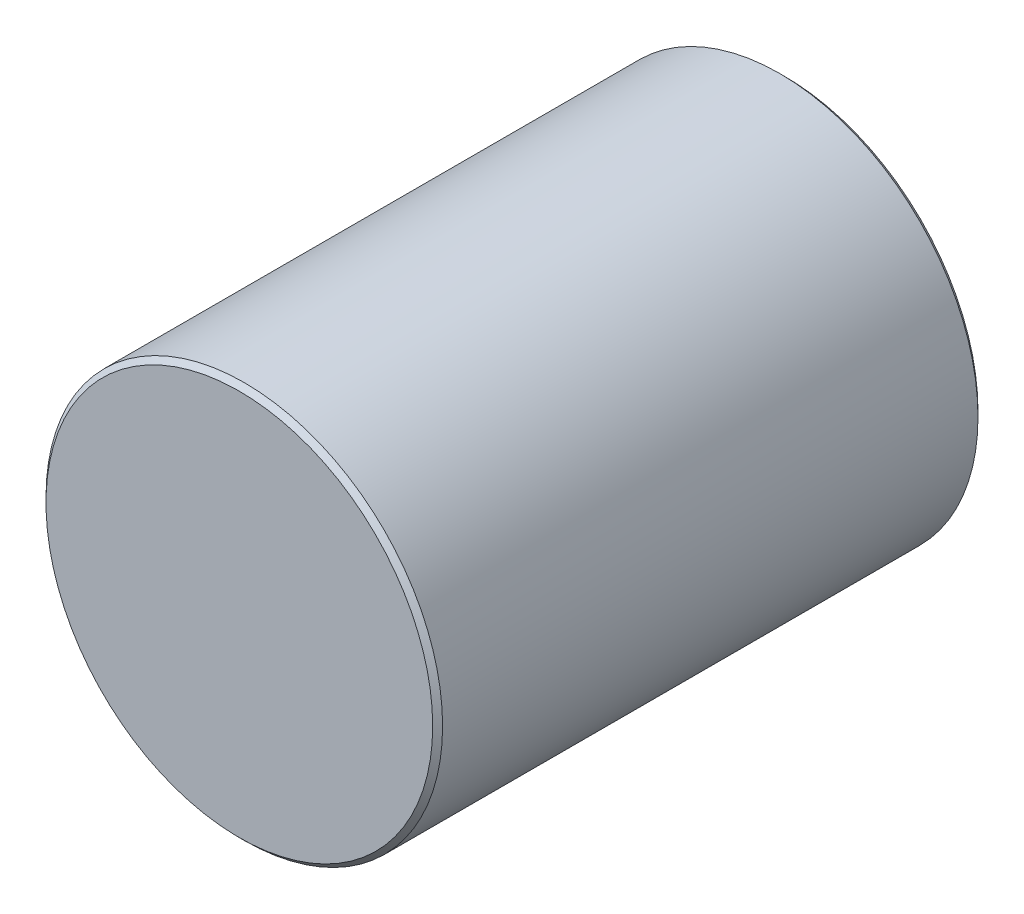
ISO-10303-21;
HEADER;
FILE_DESCRIPTION(('STEP AP214'),'2;1');
FILE_NAME('part.step','',(''),(''),'','','');
FILE_SCHEMA(('AUTOMOTIVE_DESIGN { 1 0 10303 214 1 1 1 1 }'));
ENDSEC;
DATA;
#1=APPLICATION_CONTEXT('core data for automotive mechanical design processes');
#2=APPLICATION_PROTOCOL_DEFINITION('international standard','automotive_design',2000,#1);
#3=PRODUCT_CONTEXT('',#1,'mechanical');
#4=PRODUCT('Part','Part','',(#3));
#5=PRODUCT_RELATED_PRODUCT_CATEGORY('part','',(#4));
#6=PRODUCT_DEFINITION_FORMATION('','',#4);
#7=PRODUCT_DEFINITION_CONTEXT('part definition',#1,'design');
#8=PRODUCT_DEFINITION('design','',#6,#7);
#9=PRODUCT_DEFINITION_SHAPE('','',#8);
#10=(LENGTH_UNIT() NAMED_UNIT(*) SI_UNIT(.MILLI.,.METRE.));
#11=(NAMED_UNIT(*) PLANE_ANGLE_UNIT() SI_UNIT($,.RADIAN.));
#12=(NAMED_UNIT(*) SI_UNIT($,.STERADIAN.) SOLID_ANGLE_UNIT());
#13=UNCERTAINTY_MEASURE_WITH_UNIT(LENGTH_MEASURE(1.E-05),#10,'distance_accuracy_value','');
#14=(GEOMETRIC_REPRESENTATION_CONTEXT(3) GLOBAL_UNCERTAINTY_ASSIGNED_CONTEXT((#13)) GLOBAL_UNIT_ASSIGNED_CONTEXT((#10,
#11,#12)) REPRESENTATION_CONTEXT('',''));
#15=CARTESIAN_POINT('',(0.,0.,0.));
#16=DIRECTION('',(0.,0.,1.));
#17=DIRECTION('',(1.,0.,0.));
#18=AXIS2_PLACEMENT_3D('',#15,#16,#17);
#19=CARTESIAN_POINT('',(0.,0.,11.));
#20=DIRECTION('',(0.,0.,-1.));
#21=DIRECTION('',(-1.,0.,0.));
#22=AXIS2_PLACEMENT_3D('',#19,#20,#21);
#23=CYLINDRICAL_SURFACE('',#22,4.);
#24=CARTESIAN_POINT('',(0.,0.,0.0999999999999994));
#25=DIRECTION('',(0.,0.,1.));
#26=DIRECTION('',(1.,0.,0.));
#27=AXIS2_PLACEMENT_3D('',#24,#25,#26);
#28=CIRCLE('',#27,4.);
#29=CARTESIAN_POINT('',(4.,0.,0.0999999999999994));
#30=VERTEX_POINT('',#29);
#31=EDGE_CURVE('E41',#30,#30,#28,.T.);
#32=ORIENTED_EDGE('',*,*,#31,.T.);
#33=EDGE_LOOP('',(#32));
#34=FACE_BOUND('',#33,.T.);
#35=CARTESIAN_POINT('',(0.,0.,10.9));
#36=DIRECTION('',(0.,0.,1.));
#37=DIRECTION('',(1.,0.,0.));
#38=AXIS2_PLACEMENT_3D('',#35,#36,#37);
#39=CIRCLE('',#38,4.);
#40=CARTESIAN_POINT('',(4.,0.,10.9));
#41=VERTEX_POINT('',#40);
#42=EDGE_CURVE('E45',#41,#41,#39,.F.);
#43=ORIENTED_EDGE('',*,*,#42,.T.);
#44=EDGE_LOOP('',(#43));
#45=FACE_BOUND('',#44,.T.);
#46=ADVANCED_FACE('F30',(#34,#45),#23,.T.);
#47=CARTESIAN_POINT('',(0.,0.,11.));
#48=DIRECTION('',(0.,0.,1.));
#49=DIRECTION('',(1.,0.,0.));
#50=AXIS2_PLACEMENT_3D('',#47,#48,#49);
#51=PLANE('',#50);
#52=CARTESIAN_POINT('',(0.,0.,11.));
#53=DIRECTION('',(0.,0.,1.));
#54=DIRECTION('',(1.,0.,0.));
#55=AXIS2_PLACEMENT_3D('',#52,#53,#54);
#56=CIRCLE('',#55,3.9);
#57=CARTESIAN_POINT('',(3.9,0.,11.));
#58=VERTEX_POINT('',#57);
#59=EDGE_CURVE('E10',#58,#58,#56,.T.);
#60=ORIENTED_EDGE('',*,*,#59,.T.);
#61=EDGE_LOOP('',(#60));
#62=FACE_BOUND('',#61,.T.);
#63=ADVANCED_FACE('F61',(#62),#51,.T.);
#64=CARTESIAN_POINT('',(0.,0.,0.));
#65=DIRECTION('',(0.,0.,1.));
#66=DIRECTION('',(1.,0.,0.));
#67=AXIS2_PLACEMENT_3D('',#64,#65,#66);
#68=PLANE('',#67);
#69=CARTESIAN_POINT('',(0.,0.,0.));
#70=DIRECTION('',(0.,0.,1.));
#71=DIRECTION('',(1.,0.,0.));
#72=AXIS2_PLACEMENT_3D('',#69,#70,#71);
#73=CIRCLE('',#72,3.9);
#74=CARTESIAN_POINT('',(3.9,0.,0.));
#75=VERTEX_POINT('',#74);
#76=EDGE_CURVE('E37',#75,#75,#73,.F.);
#77=ORIENTED_EDGE('',*,*,#76,.T.);
#78=EDGE_LOOP('',(#77));
#79=FACE_BOUND('',#78,.T.);
#80=ADVANCED_FACE('F58',(#79),#68,.F.);
#81=CARTESIAN_POINT('',(0.,0.,0.0999999999999994));
#82=DIRECTION('',(0.,0.,1.));
#83=DIRECTION('',(1.,0.,0.));
#84=AXIS2_PLACEMENT_3D('',#81,#82,#83);
#85=CONICAL_SURFACE('',#84,4.,0.785398163397457);
#86=ORIENTED_EDGE('',*,*,#76,.F.);
#87=EDGE_LOOP('',(#86));
#88=FACE_BOUND('',#87,.T.);
#89=ORIENTED_EDGE('',*,*,#31,.F.);
#90=EDGE_LOOP('',(#89));
#91=FACE_BOUND('',#90,.T.);
#92=ADVANCED_FACE('F54',(#88,#91),#85,.T.);
#93=CARTESIAN_POINT('',(0.,0.,11.));
#94=DIRECTION('',(0.,0.,-1.));
#95=DIRECTION('',(-1.,0.,0.));
#96=AXIS2_PLACEMENT_3D('',#93,#94,#95);
#97=CONICAL_SURFACE('',#96,3.9,0.785398163397461);
#98=ORIENTED_EDGE('',*,*,#42,.F.);
#99=EDGE_LOOP('',(#98));
#100=FACE_BOUND('',#99,.T.);
#101=ORIENTED_EDGE('',*,*,#59,.F.);
#102=EDGE_LOOP('',(#101));
#103=FACE_BOUND('',#102,.T.);
#104=ADVANCED_FACE('F32',(#100,#103),#97,.T.);
#105=CLOSED_SHELL('',(#46,#63,#80,#92,#104));
#106=MANIFOLD_SOLID_BREP('B2',#105);
#107=ADVANCED_BREP_SHAPE_REPRESENTATION('',(#18,#106),#14);
#108=SHAPE_DEFINITION_REPRESENTATION(#9,#107);
ENDSEC;
END-ISO-10303-21;
